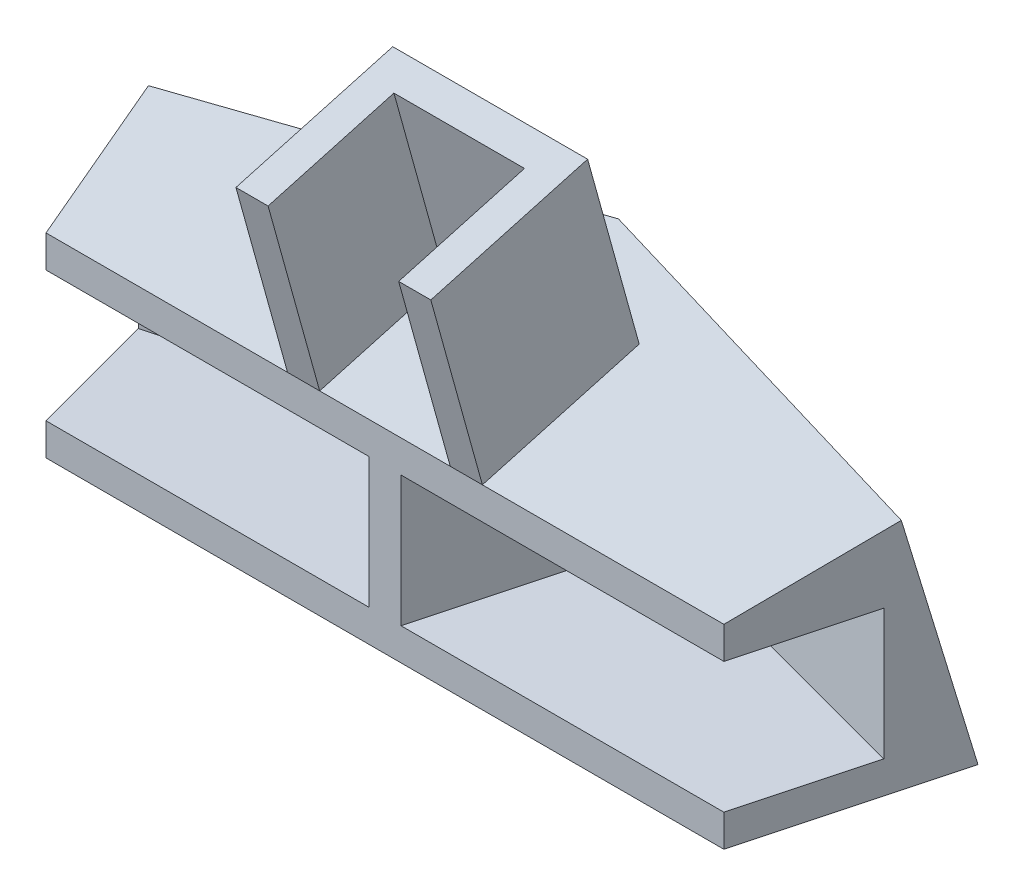
ISO-10303-21;
HEADER;
FILE_DESCRIPTION(('STEP AP214'),'2;1');
FILE_NAME('part.step','',(''),(''),'','','');
FILE_SCHEMA(('AUTOMOTIVE_DESIGN { 1 0 10303 214 1 1 1 1 }'));
ENDSEC;
DATA;
#1=APPLICATION_CONTEXT('core data for automotive mechanical design processes');
#2=APPLICATION_PROTOCOL_DEFINITION('international standard','automotive_design',2000,#1);
#3=PRODUCT_CONTEXT('',#1,'mechanical');
#4=PRODUCT('Part','Part','',(#3));
#5=PRODUCT_RELATED_PRODUCT_CATEGORY('part','',(#4));
#6=PRODUCT_DEFINITION_FORMATION('','',#4);
#7=PRODUCT_DEFINITION_CONTEXT('part definition',#1,'design');
#8=PRODUCT_DEFINITION('design','',#6,#7);
#9=PRODUCT_DEFINITION_SHAPE('','',#8);
#10=(LENGTH_UNIT() NAMED_UNIT(*) SI_UNIT(.MILLI.,.METRE.));
#11=(NAMED_UNIT(*) PLANE_ANGLE_UNIT() SI_UNIT($,.RADIAN.));
#12=(NAMED_UNIT(*) SI_UNIT($,.STERADIAN.) SOLID_ANGLE_UNIT());
#13=UNCERTAINTY_MEASURE_WITH_UNIT(LENGTH_MEASURE(1.E-05),#10,'distance_accuracy_value','');
#14=(GEOMETRIC_REPRESENTATION_CONTEXT(3) GLOBAL_UNCERTAINTY_ASSIGNED_CONTEXT((#13)) GLOBAL_UNIT_ASSIGNED_CONTEXT((#10,
#11,#12)) REPRESENTATION_CONTEXT('',''));
#15=CARTESIAN_POINT('',(0.,0.,0.));
#16=DIRECTION('',(0.,0.,1.));
#17=DIRECTION('',(1.,0.,0.));
#18=AXIS2_PLACEMENT_3D('',#15,#16,#17);
#19=CARTESIAN_POINT('',(-61.0498594987614,30.3,14.1213305174945));
#20=DIRECTION('',(0.,-0.963611374994283,-0.267307160363557));
#21=DIRECTION('',(0.,0.267307160363557,-0.963611374994283));
#22=AXIS2_PLACEMENT_3D('',#19,#20,#21);
#23=PLANE('',#22);
#24=DIRECTION('',(-1.,0.,0.));
#25=VECTOR('',#24,1.);
#26=CARTESIAN_POINT('',(-15.15,37.062871157198,-10.2580372698608));
#27=LINE('',#26,#25);
#28=CARTESIAN_POINT('',(15.15,37.062871157198,-10.2580372698608));
#29=VERTEX_POINT('',#28);
#30=CARTESIAN_POINT('',(-15.15,37.062871157198,-10.2580372698608));
#31=VERTEX_POINT('',#30);
#32=EDGE_CURVE('E278',#29,#31,#27,.T.);
#33=ORIENTED_EDGE('',*,*,#32,.F.);
#34=DIRECTION('',(0.,-0.267307160363556,0.963611374994283));
#35=VECTOR('',#34,1.);
#36=CARTESIAN_POINT('',(15.15,30.3,14.1213305174945));
#37=LINE('',#36,#35);
#38=CARTESIAN_POINT('',(15.15,30.3,14.1213305174945));
#39=VERTEX_POINT('',#38);
#40=EDGE_CURVE('E201',#29,#39,#37,.T.);
#41=ORIENTED_EDGE('',*,*,#40,.T.);
#42=DIRECTION('',(1.,0.,0.));
#43=VECTOR('',#42,1.);
#44=CARTESIAN_POINT('',(-61.0498594987614,30.3,14.1213305174945));
#45=LINE('',#44,#43);
#46=CARTESIAN_POINT('',(52.701522961763,30.3,14.1213305174945));
#47=VERTEX_POINT('',#46);
#48=EDGE_CURVE('E297',#39,#47,#45,.T.);
#49=ORIENTED_EDGE('',*,*,#48,.T.);
#50=DIRECTION('',(-0.249999999999998,-0.258819045102513,0.933012701892222));
#51=VECTOR('',#50,1.);
#52=CARTESIAN_POINT('',(60.796195201352,38.680221357873,-16.0883975512691));
#53=LINE('',#52,#51);
#54=CARTESIAN_POINT('',(58.5300727238019,36.3341587349735,-7.6311133288782));
#55=VERTEX_POINT('',#54);
#56=EDGE_CURVE('E189',#55,#47,#53,.T.);
#57=ORIENTED_EDGE('',*,*,#56,.F.);
#58=DIRECTION('',(0.968245836551855,-0.0668267900908885,0.240902843748568));
#59=VECTOR('',#58,1.);
#60=CARTESIAN_POINT('',(-59.042365341713,44.4488217084377,-36.8835341575611));
#61=LINE('',#60,#59);
#62=CARTESIAN_POINT('',(0.,40.3738114102148,-22.1935936739401));
#63=VERTEX_POINT('',#62);
#64=EDGE_CURVE('E11',#63,#55,#61,.T.);
#65=ORIENTED_EDGE('',*,*,#64,.F.);
#66=DIRECTION('',(0.968245836551855,0.0668267900908885,-0.240902843748568));
#67=VECTOR('',#66,1.);
#68=CARTESIAN_POINT('',(2.08207098063319,40.5175126430263,-22.7116199862526));
#69=LINE('',#68,#67);
#70=CARTESIAN_POINT('',(-58.5300727238019,36.3341587349735,-7.6311133288782));
#71=VERTEX_POINT('',#70);
#72=EDGE_CURVE('E41',#71,#63,#69,.T.);
#73=ORIENTED_EDGE('',*,*,#72,.F.);
#74=DIRECTION('',(-0.249999999999998,0.258819045102513,-0.933012701892222));
#75=VECTOR('',#74,1.);
#76=CARTESIAN_POINT('',(-60.796195201352,38.680221357873,-16.0883975512691));
#77=LINE('',#76,#75);
#78=CARTESIAN_POINT('',(-52.701522961763,30.3,14.1213305174945));
#79=VERTEX_POINT('',#78);
#80=EDGE_CURVE('E301',#79,#71,#77,.T.);
#81=ORIENTED_EDGE('',*,*,#80,.F.);
#82=CARTESIAN_POINT('',(-15.15,30.3,14.1213305174945));
#83=VERTEX_POINT('',#82);
#84=EDGE_CURVE('E298',#79,#83,#45,.T.);
#85=ORIENTED_EDGE('',*,*,#84,.T.);
#86=DIRECTION('',(0.,-0.267307160363556,0.963611374994283));
#87=VECTOR('',#86,1.);
#88=CARTESIAN_POINT('',(-15.15,30.3,14.1213305174945));
#89=LINE('',#88,#87);
#90=EDGE_CURVE('E281',#31,#83,#89,.T.);
#91=ORIENTED_EDGE('',*,*,#90,.F.);
#92=EDGE_LOOP('',(#33,#41,#49,#57,#65,#73,#81,#85,#91));
#93=FACE_BOUND('',#92,.T.);
#94=ADVANCED_FACE('F33',(#93),#23,.F.);
#95=CARTESIAN_POINT('',(63.1319304793945,5.,-24.805480281955));
#96=DIRECTION('',(0.965925826289069,0.,0.258819045102518));
#97=DIRECTION('',(0.258819045102518,0.,-0.965925826289069));
#98=AXIS2_PLACEMENT_3D('',#95,#96,#97);
#99=PLANE('',#98);
#100=DIRECTION('',(-0.0669872981077778,0.965925826289071,0.249999999999992));
#101=VECTOR('',#100,1.);
#102=CARTESIAN_POINT('',(61.0498594987614,0.,-17.0350855972672));
#103=LINE('',#102,#101);
#104=CARTESIAN_POINT('',(61.0498594987614,0.,-17.0350855972672));
#105=VERTEX_POINT('',#104);
#106=EDGE_CURVE('E223',#105,#55,#103,.T.);
#107=ORIENTED_EDGE('',*,*,#106,.T.);
#108=ORIENTED_EDGE('',*,*,#56,.T.);
#109=DIRECTION('',(0.,-1.,0.));
#110=VECTOR('',#109,1.);
#111=CARTESIAN_POINT('',(52.701522961763,45.3,14.1213305174945));
#112=LINE('',#111,#110);
#113=CARTESIAN_POINT('',(52.701522961763,25.3,14.1213305174945));
#114=VERTEX_POINT('',#113);
#115=EDGE_CURVE('E234',#47,#114,#112,.T.);
#116=ORIENTED_EDGE('',*,*,#115,.T.);
#117=DIRECTION('',(-0.258819045102518,0.,0.965925826289069));
#118=VECTOR('',#117,1.);
#119=CARTESIAN_POINT('',(52.701522961763,25.3,14.1213305174945));
#120=LINE('',#119,#118);
#121=CARTESIAN_POINT('',(57.9555495773441,25.3,-5.4869637561736));
#122=VERTEX_POINT('',#121);
#123=EDGE_CURVE('E231',#122,#114,#120,.T.);
#124=ORIENTED_EDGE('',*,*,#123,.F.);
#125=DIRECTION('',(0.,-1.,0.));
#126=VECTOR('',#125,1.);
#127=CARTESIAN_POINT('',(57.9555495773441,25.3,-5.4869637561736));
#128=LINE('',#127,#126);
#129=CARTESIAN_POINT('',(57.9555495773441,5.,-5.48696375617361));
#130=VERTEX_POINT('',#129);
#131=EDGE_CURVE('E239',#122,#130,#128,.T.);
#132=ORIENTED_EDGE('',*,*,#131,.T.);
#133=DIRECTION('',(-0.258819045102518,0.,0.965925826289069));
#134=VECTOR('',#133,1.);
#135=CARTESIAN_POINT('',(63.1319304793945,5.,-24.805480281955));
#136=LINE('',#135,#134);
#137=CARTESIAN_POINT('',(52.701522961763,5.,14.1213305174945));
#138=VERTEX_POINT('',#137);
#139=EDGE_CURVE('E246',#130,#138,#136,.T.);
#140=ORIENTED_EDGE('',*,*,#139,.T.);
#141=DIRECTION('',(0.,-1.,0.));
#142=VECTOR('',#141,1.);
#143=CARTESIAN_POINT('',(52.701522961763,5.,14.1213305174945));
#144=LINE('',#143,#142);
#145=CARTESIAN_POINT('',(52.701522961763,0.,14.1213305174945));
#146=VERTEX_POINT('',#145);
#147=EDGE_CURVE('E248',#138,#146,#144,.T.);
#148=ORIENTED_EDGE('',*,*,#147,.T.);
#149=DIRECTION('',(-0.258819045102518,0.,0.965925826289069));
#150=VECTOR('',#149,1.);
#151=CARTESIAN_POINT('',(63.1319304793945,0.,-24.805480281955));
#152=LINE('',#151,#150);
#153=EDGE_CURVE('E243',#105,#146,#152,.T.);
#154=ORIENTED_EDGE('',*,*,#153,.F.);
#155=EDGE_LOOP('',(#107,#108,#116,#124,#132,#140,#148,#154));
#156=FACE_BOUND('',#155,.T.);
#157=ADVANCED_FACE('F393',(#156),#99,.T.);
#158=CARTESIAN_POINT('',(0.,5.,14.1213305174945));
#159=DIRECTION('',(0.,0.,-1.));
#160=DIRECTION('',(-1.,0.,0.));
#161=AXIS2_PLACEMENT_3D('',#158,#159,#160);
#162=PLANE('',#161);
#163=ORIENTED_EDGE('',*,*,#115,.F.);
#164=ORIENTED_EDGE('',*,*,#48,.F.);
#165=DIRECTION('',(-1.,0.,0.));
#166=VECTOR('',#165,1.);
#167=CARTESIAN_POINT('',(10.15,30.3,14.1213305174945));
#168=LINE('',#167,#166);
#169=CARTESIAN_POINT('',(10.15,30.3,14.1213305174945));
#170=VERTEX_POINT('',#169);
#171=EDGE_CURVE('E211',#39,#170,#168,.T.);
#172=ORIENTED_EDGE('',*,*,#171,.T.);
#173=CARTESIAN_POINT('',(-10.15,30.3,14.1213305174945));
#174=VERTEX_POINT('',#173);
#175=EDGE_CURVE('E302',#174,#170,#45,.T.);
#176=ORIENTED_EDGE('',*,*,#175,.F.);
#177=DIRECTION('',(1.,0.,0.));
#178=VECTOR('',#177,1.);
#179=CARTESIAN_POINT('',(-10.15,30.3,14.1213305174945));
#180=LINE('',#179,#178);
#181=EDGE_CURVE('E265',#83,#174,#180,.T.);
#182=ORIENTED_EDGE('',*,*,#181,.F.);
#183=ORIENTED_EDGE('',*,*,#84,.F.);
#184=DIRECTION('',(0.,-1.,0.));
#185=VECTOR('',#184,1.);
#186=CARTESIAN_POINT('',(-52.701522961763,45.3,14.1213305174945));
#187=LINE('',#186,#185);
#188=CARTESIAN_POINT('',(-52.701522961763,25.3,14.1213305174945));
#189=VERTEX_POINT('',#188);
#190=EDGE_CURVE('E319',#79,#189,#187,.T.);
#191=ORIENTED_EDGE('',*,*,#190,.T.);
#192=DIRECTION('',(1.,0.,0.));
#193=VECTOR('',#192,1.);
#194=CARTESIAN_POINT('',(0.,25.3,14.1213305174945));
#195=LINE('',#194,#193);
#196=CARTESIAN_POINT('',(-2.5,25.3,14.1213305174945));
#197=VERTEX_POINT('',#196);
#198=EDGE_CURVE('E316',#189,#197,#195,.T.);
#199=ORIENTED_EDGE('',*,*,#198,.T.);
#200=DIRECTION('',(0.,-1.,0.));
#201=VECTOR('',#200,1.);
#202=CARTESIAN_POINT('',(-2.5,62.1541007624613,14.1213305174945));
#203=LINE('',#202,#201);
#204=CARTESIAN_POINT('',(-2.5,5.,14.1213305174945));
#205=VERTEX_POINT('',#204);
#206=EDGE_CURVE('E256',#197,#205,#203,.T.);
#207=ORIENTED_EDGE('',*,*,#206,.T.);
#208=DIRECTION('',(1.,0.,0.));
#209=VECTOR('',#208,1.);
#210=CARTESIAN_POINT('',(0.,5.,14.1213305174945));
#211=LINE('',#210,#209);
#212=CARTESIAN_POINT('',(-52.701522961763,5.,14.1213305174945));
#213=VERTEX_POINT('',#212);
#214=EDGE_CURVE('E333',#213,#205,#211,.T.);
#215=ORIENTED_EDGE('',*,*,#214,.F.);
#216=DIRECTION('',(0.,-1.,0.));
#217=VECTOR('',#216,1.);
#218=CARTESIAN_POINT('',(-52.701522961763,5.,14.1213305174945));
#219=LINE('',#218,#217);
#220=CARTESIAN_POINT('',(-52.701522961763,0.,14.1213305174945));
#221=VERTEX_POINT('',#220);
#222=EDGE_CURVE('E337',#213,#221,#219,.T.);
#223=ORIENTED_EDGE('',*,*,#222,.T.);
#224=DIRECTION('',(1.,0.,0.));
#225=VECTOR('',#224,1.);
#226=CARTESIAN_POINT('',(0.,0.,14.1213305174945));
#227=LINE('',#226,#225);
#228=EDGE_CURVE('E334',#221,#146,#227,.T.);
#229=ORIENTED_EDGE('',*,*,#228,.T.);
#230=ORIENTED_EDGE('',*,*,#147,.F.);
#231=DIRECTION('',(-1.,0.,0.));
#232=VECTOR('',#231,1.);
#233=CARTESIAN_POINT('',(0.,5.,14.1213305174945));
#234=LINE('',#233,#232);
#235=CARTESIAN_POINT('',(2.5,5.,14.1213305174945));
#236=VERTEX_POINT('',#235);
#237=EDGE_CURVE('E244',#138,#236,#234,.T.);
#238=ORIENTED_EDGE('',*,*,#237,.T.);
#239=DIRECTION('',(0.,-1.,0.));
#240=VECTOR('',#239,1.);
#241=CARTESIAN_POINT('',(2.5,62.1541007624613,14.1213305174945));
#242=LINE('',#241,#240);
#243=CARTESIAN_POINT('',(2.5,25.3,14.1213305174945));
#244=VERTEX_POINT('',#243);
#245=EDGE_CURVE('E212',#244,#236,#242,.T.);
#246=ORIENTED_EDGE('',*,*,#245,.F.);
#247=DIRECTION('',(-1.,0.,0.));
#248=VECTOR('',#247,1.);
#249=CARTESIAN_POINT('',(0.,25.3,14.1213305174945));
#250=LINE('',#249,#248);
#251=EDGE_CURVE('E229',#114,#244,#250,.T.);
#252=ORIENTED_EDGE('',*,*,#251,.F.);
#253=EDGE_LOOP('',(#163,#164,#172,#176,#182,#183,#191,#199,#207,#215,#223,#229,#230,#238,#246,#252));
#254=FACE_BOUND('',#253,.T.);
#255=ADVANCED_FACE('F357',(#254),#162,.F.);
#256=CARTESIAN_POINT('',(-59.042365341713,0.,-49.2137002605287));
#257=DIRECTION('',(0.249999999999998,0.258819045102513,-0.933012701892222));
#258=DIRECTION('',(0.,0.963611374994283,0.267307160363556));
#259=AXIS2_PLACEMENT_3D('',#256,#257,#258);
#260=PLANE('',#259);
#261=DIRECTION('',(0.,0.963611374994283,0.267307160363556));
#262=VECTOR('',#261,1.);
#263=CARTESIAN_POINT('',(0.,2.49753320224061,-32.7005268999761));
#264=LINE('',#263,#262);
#265=CARTESIAN_POINT('',(0.,0.,-33.3933461479936));
#266=VERTEX_POINT('',#265);
#267=EDGE_CURVE('E310',#266,#63,#264,.T.);
#268=ORIENTED_EDGE('',*,*,#267,.T.);
#269=ORIENTED_EDGE('',*,*,#64,.T.);
#270=ORIENTED_EDGE('',*,*,#106,.F.);
#271=DIRECTION('',(0.965925826289069,0.,0.258819045102518));
#272=VECTOR('',#271,1.);
#273=CARTESIAN_POINT('',(-59.042365341713,0.,-49.2137002605287));
#274=LINE('',#273,#272);
#275=EDGE_CURVE('E226',#266,#105,#274,.T.);
#276=ORIENTED_EDGE('',*,*,#275,.F.);
#277=EDGE_LOOP('',(#268,#269,#270,#276));
#278=FACE_BOUND('',#277,.T.);
#279=ADVANCED_FACE('F422',(#278),#260,.T.);
#280=CARTESIAN_POINT('',(0.,0.,0.));
#281=DIRECTION('',(0.,1.,0.));
#282=DIRECTION('',(0.,0.,1.));
#283=AXIS2_PLACEMENT_3D('',#280,#281,#282);
#284=PLANE('',#283);
#285=ORIENTED_EDGE('',*,*,#275,.T.);
#286=ORIENTED_EDGE('',*,*,#153,.T.);
#287=ORIENTED_EDGE('',*,*,#228,.F.);
#288=DIRECTION('',(0.258819045102518,0.,0.965925826289069));
#289=VECTOR('',#288,1.);
#290=CARTESIAN_POINT('',(-63.1319304793945,0.,-24.805480281955));
#291=LINE('',#290,#289);
#292=CARTESIAN_POINT('',(-61.0498594987614,0.,-17.0350855972672));
#293=VERTEX_POINT('',#292);
#294=EDGE_CURVE('E330',#293,#221,#291,.T.);
#295=ORIENTED_EDGE('',*,*,#294,.F.);
#296=DIRECTION('',(-0.965925826289069,0.,0.258819045102518));
#297=VECTOR('',#296,1.);
#298=CARTESIAN_POINT('',(2.08207098063319,0.,-33.9512353858385));
#299=LINE('',#298,#297);
#300=EDGE_CURVE('E308',#266,#293,#299,.T.);
#301=ORIENTED_EDGE('',*,*,#300,.F.);
#302=EDGE_LOOP('',(#285,#286,#287,#295,#301));
#303=FACE_BOUND('',#302,.T.);
#304=ADVANCED_FACE('F419',(#303),#284,.F.);
#305=CARTESIAN_POINT('',(0.,5.,0.));
#306=DIRECTION('',(0.,1.,0.));
#307=DIRECTION('',(0.,0.,1.));
#308=AXIS2_PLACEMENT_3D('',#305,#306,#307);
#309=PLANE('',#308);
#310=ORIENTED_EDGE('',*,*,#214,.T.);
#311=DIRECTION('',(0.258819045102518,0.,0.965925826289069));
#312=VECTOR('',#311,1.);
#313=CARTESIAN_POINT('',(-2.5,5.,14.1213305174945));
#314=LINE('',#313,#312);
#315=CARTESIAN_POINT('',(-11.1168909996853,5.,-18.0373444966142));
#316=VERTEX_POINT('',#315);
#317=EDGE_CURVE('E253',#316,#205,#314,.T.);
#318=ORIENTED_EDGE('',*,*,#317,.F.);
#319=DIRECTION('',(0.965925826289069,0.,-0.258819045102518));
#320=VECTOR('',#319,1.);
#321=CARTESIAN_POINT('',(-57.9555495773441,5.,-5.4869637561736));
#322=LINE('',#321,#320);
#323=CARTESIAN_POINT('',(-57.9555495773441,5.,-5.4869637561736));
#324=VERTEX_POINT('',#323);
#325=EDGE_CURVE('E321',#324,#316,#322,.T.);
#326=ORIENTED_EDGE('',*,*,#325,.F.);
#327=DIRECTION('',(0.258819045102518,0.,0.965925826289069));
#328=VECTOR('',#327,1.);
#329=CARTESIAN_POINT('',(-63.1319304793945,5.,-24.805480281955));
#330=LINE('',#329,#328);
#331=EDGE_CURVE('E331',#324,#213,#330,.T.);
#332=ORIENTED_EDGE('',*,*,#331,.T.);
#333=EDGE_LOOP('',(#310,#318,#326,#332));
#334=FACE_BOUND('',#333,.T.);
#335=ADVANCED_FACE('F413',(#334),#309,.T.);
#336=CARTESIAN_POINT('',(-57.9555495773441,25.3,-5.4869637561736));
#337=DIRECTION('',(-0.258819045102518,0.,-0.965925826289069));
#338=DIRECTION('',(-0.965925826289069,0.,0.258819045102518));
#339=AXIS2_PLACEMENT_3D('',#336,#337,#338);
#340=PLANE('',#339);
#341=DIRECTION('',(0.,-1.,0.));
#342=VECTOR('',#341,1.);
#343=CARTESIAN_POINT('',(-11.1168909996853,62.1541007624613,-18.0373444966142));
#344=LINE('',#343,#342);
#345=CARTESIAN_POINT('',(-11.1168909996853,25.3,-18.0373444966142));
#346=VERTEX_POINT('',#345);
#347=EDGE_CURVE('E252',#346,#316,#344,.T.);
#348=ORIENTED_EDGE('',*,*,#347,.F.);
#349=DIRECTION('',(0.965925826289069,0.,-0.258819045102518));
#350=VECTOR('',#349,1.);
#351=CARTESIAN_POINT('',(-57.9555495773441,25.3,-5.4869637561736));
#352=LINE('',#351,#350);
#353=CARTESIAN_POINT('',(-57.9555495773441,25.3,-5.4869637561736));
#354=VERTEX_POINT('',#353);
#355=EDGE_CURVE('E322',#354,#346,#352,.T.);
#356=ORIENTED_EDGE('',*,*,#355,.F.);
#357=DIRECTION('',(0.,-1.,0.));
#358=VECTOR('',#357,1.);
#359=CARTESIAN_POINT('',(-57.9555495773441,25.3,-5.4869637561736));
#360=LINE('',#359,#358);
#361=EDGE_CURVE('E325',#354,#324,#360,.T.);
#362=ORIENTED_EDGE('',*,*,#361,.T.);
#363=ORIENTED_EDGE('',*,*,#325,.T.);
#364=EDGE_LOOP('',(#348,#356,#362,#363));
#365=FACE_BOUND('',#364,.T.);
#366=ADVANCED_FACE('F407',(#365),#340,.F.);
#367=CARTESIAN_POINT('',(0.,25.3,0.));
#368=DIRECTION('',(0.,1.,0.));
#369=DIRECTION('',(0.,0.,1.));
#370=AXIS2_PLACEMENT_3D('',#367,#368,#369);
#371=PLANE('',#370);
#372=DIRECTION('',(0.258819045102518,0.,0.965925826289069));
#373=VECTOR('',#372,1.);
#374=CARTESIAN_POINT('',(-2.5,25.3,14.1213305174945));
#375=LINE('',#374,#373);
#376=EDGE_CURVE('E257',#346,#197,#375,.T.);
#377=ORIENTED_EDGE('',*,*,#376,.T.);
#378=ORIENTED_EDGE('',*,*,#198,.F.);
#379=DIRECTION('',(0.258819045102518,0.,0.965925826289069));
#380=VECTOR('',#379,1.);
#381=CARTESIAN_POINT('',(-52.701522961763,25.3,14.1213305174945));
#382=LINE('',#381,#380);
#383=EDGE_CURVE('E313',#354,#189,#382,.T.);
#384=ORIENTED_EDGE('',*,*,#383,.F.);
#385=ORIENTED_EDGE('',*,*,#355,.T.);
#386=EDGE_LOOP('',(#377,#378,#384,#385));
#387=FACE_BOUND('',#386,.T.);
#388=ADVANCED_FACE('F402',(#387),#371,.F.);
#389=ORIENTED_EDGE('',*,*,#175,.T.);
#390=DIRECTION('',(0.,0.267307160363557,-0.963611374994283));
#391=VECTOR('',#390,1.);
#392=CARTESIAN_POINT('',(10.15,30.3,14.1213305174945));
#393=LINE('',#392,#391);
#394=CARTESIAN_POINT('',(10.15,35.7263353553802,-5.43998039488942));
#395=VERTEX_POINT('',#394);
#396=EDGE_CURVE('E184',#170,#395,#393,.T.);
#397=ORIENTED_EDGE('',*,*,#396,.T.);
#398=DIRECTION('',(1.,0.,0.));
#399=VECTOR('',#398,1.);
#400=CARTESIAN_POINT('',(-10.15,35.7263353553802,-5.43998039488942));
#401=LINE('',#400,#399);
#402=CARTESIAN_POINT('',(-10.15,35.7263353553802,-5.43998039488942));
#403=VERTEX_POINT('',#402);
#404=EDGE_CURVE('E276',#403,#395,#401,.T.);
#405=ORIENTED_EDGE('',*,*,#404,.F.);
#406=DIRECTION('',(0.,0.267307160363557,-0.963611374994283));
#407=VECTOR('',#406,1.);
#408=CARTESIAN_POINT('',(-10.15,30.3,14.1213305174945));
#409=LINE('',#408,#407);
#410=EDGE_CURVE('E260',#174,#403,#409,.T.);
#411=ORIENTED_EDGE('',*,*,#410,.F.);
#412=EDGE_LOOP('',(#389,#397,#405,#411));
#413=FACE_BOUND('',#412,.T.);
#414=ADVANCED_FACE('F379',(#413),#23,.F.);
#415=CARTESIAN_POINT('',(-63.1319304793945,5.,-24.805480281955));
#416=DIRECTION('',(0.965925826289069,0.,-0.258819045102518));
#417=DIRECTION('',(-0.258819045102518,0.,-0.965925826289069));
#418=AXIS2_PLACEMENT_3D('',#415,#416,#417);
#419=PLANE('',#418);
#420=ORIENTED_EDGE('',*,*,#190,.F.);
#421=ORIENTED_EDGE('',*,*,#80,.T.);
#422=DIRECTION('',(0.0669872981077778,0.965925826289071,0.249999999999992));
#423=VECTOR('',#422,1.);
#424=CARTESIAN_POINT('',(-61.0498594987614,0.,-17.0350855972672));
#425=LINE('',#424,#423);
#426=EDGE_CURVE('E305',#293,#71,#425,.T.);
#427=ORIENTED_EDGE('',*,*,#426,.F.);
#428=ORIENTED_EDGE('',*,*,#294,.T.);
#429=ORIENTED_EDGE('',*,*,#222,.F.);
#430=ORIENTED_EDGE('',*,*,#331,.F.);
#431=ORIENTED_EDGE('',*,*,#361,.F.);
#432=ORIENTED_EDGE('',*,*,#383,.T.);
#433=EDGE_LOOP('',(#420,#421,#427,#428,#429,#430,#431,#432));
#434=FACE_BOUND('',#433,.T.);
#435=ADVANCED_FACE('F35',(#434),#419,.F.);
#436=CARTESIAN_POINT('',(2.08207098063319,0.,-33.9512353858385));
#437=DIRECTION('',(0.249999999999998,-0.258819045102513,0.933012701892222));
#438=DIRECTION('',(0.,-0.963611374994283,-0.267307160363556));
#439=AXIS2_PLACEMENT_3D('',#436,#437,#438);
#440=PLANE('',#439);
#441=ORIENTED_EDGE('',*,*,#426,.T.);
#442=ORIENTED_EDGE('',*,*,#72,.T.);
#443=ORIENTED_EDGE('',*,*,#267,.F.);
#444=ORIENTED_EDGE('',*,*,#300,.T.);
#445=EDGE_LOOP('',(#441,#442,#443,#444));
#446=FACE_BOUND('',#445,.T.);
#447=ADVANCED_FACE('F345',(#446),#440,.F.);
#448=CARTESIAN_POINT('',(-10.15,59.2083412498285,22.1405453284012));
#449=DIRECTION('',(-1.,0.,0.));
#450=DIRECTION('',(0.,-1.,0.));
#451=AXIS2_PLACEMENT_3D('',#448,#449,#450);
#452=PLANE('',#451);
#453=ORIENTED_EDGE('',*,*,#410,.T.);
#454=DIRECTION('',(0.,-0.963611374994283,-0.267307160363557));
#455=VECTOR('',#454,1.);
#456=CARTESIAN_POINT('',(-10.15,64.6346766052087,2.57923441601728));
#457=LINE('',#456,#455);
#458=CARTESIAN_POINT('',(-10.15,64.6346766052087,2.57923441601728));
#459=VERTEX_POINT('',#458);
#460=EDGE_CURVE('E294',#459,#403,#457,.T.);
#461=ORIENTED_EDGE('',*,*,#460,.F.);
#462=DIRECTION('',(0.,0.267307160363557,-0.963611374994283));
#463=VECTOR('',#462,1.);
#464=CARTESIAN_POINT('',(-10.15,59.2083412498285,22.1405453284012));
#465=LINE('',#464,#463);
#466=CARTESIAN_POINT('',(-10.15,59.2083412498285,22.1405453284012));
#467=VERTEX_POINT('',#466);
#468=EDGE_CURVE('E263',#467,#459,#465,.T.);
#469=ORIENTED_EDGE('',*,*,#468,.F.);
#470=DIRECTION('',(0.,-0.963611374994283,-0.267307160363557));
#471=VECTOR('',#470,1.);
#472=CARTESIAN_POINT('',(-10.15,59.2083412498285,22.1405453284012));
#473=LINE('',#472,#471);
#474=EDGE_CURVE('E273',#467,#174,#473,.T.);
#475=ORIENTED_EDGE('',*,*,#474,.T.);
#476=EDGE_LOOP('',(#453,#461,#469,#475));
#477=FACE_BOUND('',#476,.T.);
#478=ADVANCED_FACE('F381',(#477),#452,.F.);
#479=CARTESIAN_POINT('',(-10.15,64.6346766052087,2.57923441601728));
#480=DIRECTION('',(0.,0.267307160363557,-0.963611374994283));
#481=DIRECTION('',(0.,0.963611374994283,0.267307160363557));
#482=AXIS2_PLACEMENT_3D('',#479,#480,#481);
#483=PLANE('',#482);
#484=ORIENTED_EDGE('',*,*,#404,.T.);
#485=DIRECTION('',(0.,-0.963611374994283,-0.267307160363557));
#486=VECTOR('',#485,1.);
#487=CARTESIAN_POINT('',(10.15,64.6346766052087,2.57923441601727));
#488=LINE('',#487,#486);
#489=CARTESIAN_POINT('',(10.15,64.6346766052087,2.57923441601727));
#490=VERTEX_POINT('',#489);
#491=EDGE_CURVE('E206',#490,#395,#488,.T.);
#492=ORIENTED_EDGE('',*,*,#491,.F.);
#493=DIRECTION('',(1.,0.,0.));
#494=VECTOR('',#493,1.);
#495=CARTESIAN_POINT('',(-10.15,64.6346766052087,2.57923441601728));
#496=LINE('',#495,#494);
#497=EDGE_CURVE('E199',#459,#490,#496,.T.);
#498=ORIENTED_EDGE('',*,*,#497,.F.);
#499=ORIENTED_EDGE('',*,*,#460,.T.);
#500=EDGE_LOOP('',(#484,#492,#498,#499));
#501=FACE_BOUND('',#500,.T.);
#502=ADVANCED_FACE('F383',(#501),#483,.F.);
#503=CARTESIAN_POINT('',(-15.15,65.9712124070265,-2.23882245895414));
#504=DIRECTION('',(0.,-0.267307160363557,0.963611374994283));
#505=DIRECTION('',(0.,-0.963611374994283,-0.267307160363557));
#506=AXIS2_PLACEMENT_3D('',#503,#504,#505);
#507=PLANE('',#506);
#508=ORIENTED_EDGE('',*,*,#32,.T.);
#509=DIRECTION('',(0.,-0.963611374994283,-0.267307160363557));
#510=VECTOR('',#509,1.);
#511=CARTESIAN_POINT('',(-15.15,65.9712124070265,-2.23882245895414));
#512=LINE('',#511,#510);
#513=CARTESIAN_POINT('',(-15.15,65.9712124070265,-2.23882245895414));
#514=VERTEX_POINT('',#513);
#515=EDGE_CURVE('E291',#514,#31,#512,.T.);
#516=ORIENTED_EDGE('',*,*,#515,.F.);
#517=DIRECTION('',(-1.,0.,0.));
#518=VECTOR('',#517,1.);
#519=CARTESIAN_POINT('',(-15.15,65.9712124070265,-2.23882245895414));
#520=LINE('',#519,#518);
#521=CARTESIAN_POINT('',(15.15,65.9712124070265,-2.23882245895414));
#522=VERTEX_POINT('',#521);
#523=EDGE_CURVE('E267',#522,#514,#520,.T.);
#524=ORIENTED_EDGE('',*,*,#523,.F.);
#525=DIRECTION('',(0.,-0.963611374994283,-0.267307160363557));
#526=VECTOR('',#525,1.);
#527=CARTESIAN_POINT('',(15.15,65.9712124070265,-2.23882245895414));
#528=LINE('',#527,#526);
#529=EDGE_CURVE('E217',#522,#29,#528,.T.);
#530=ORIENTED_EDGE('',*,*,#529,.T.);
#531=EDGE_LOOP('',(#508,#516,#524,#530));
#532=FACE_BOUND('',#531,.T.);
#533=ADVANCED_FACE('F372',(#532),#507,.F.);
#534=CARTESIAN_POINT('',(-15.15,59.2083412498285,22.1405453284012));
#535=DIRECTION('',(1.,0.,0.));
#536=DIRECTION('',(0.,1.,0.));
#537=AXIS2_PLACEMENT_3D('',#534,#535,#536);
#538=PLANE('',#537);
#539=ORIENTED_EDGE('',*,*,#90,.T.);
#540=DIRECTION('',(0.,-0.963611374994283,-0.267307160363557));
#541=VECTOR('',#540,1.);
#542=CARTESIAN_POINT('',(-15.15,59.2083412498285,22.1405453284012));
#543=LINE('',#542,#541);
#544=CARTESIAN_POINT('',(-15.15,59.2083412498285,22.1405453284012));
#545=VERTEX_POINT('',#544);
#546=EDGE_CURVE('E288',#545,#83,#543,.T.);
#547=ORIENTED_EDGE('',*,*,#546,.F.);
#548=DIRECTION('',(0.,-0.267307160363556,0.963611374994283));
#549=VECTOR('',#548,1.);
#550=CARTESIAN_POINT('',(-15.15,59.2083412498285,22.1405453284012));
#551=LINE('',#550,#549);
#552=EDGE_CURVE('E269',#514,#545,#551,.T.);
#553=ORIENTED_EDGE('',*,*,#552,.F.);
#554=ORIENTED_EDGE('',*,*,#515,.T.);
#555=EDGE_LOOP('',(#539,#547,#553,#554));
#556=FACE_BOUND('',#555,.T.);
#557=ADVANCED_FACE('F361',(#556),#538,.F.);
#558=CARTESIAN_POINT('',(-10.15,59.2083412498285,22.1405453284012));
#559=DIRECTION('',(0.,0.267307160363557,-0.963611374994283));
#560=DIRECTION('',(0.,0.963611374994283,0.267307160363557));
#561=AXIS2_PLACEMENT_3D('',#558,#559,#560);
#562=PLANE('',#561);
#563=ORIENTED_EDGE('',*,*,#181,.T.);
#564=ORIENTED_EDGE('',*,*,#474,.F.);
#565=DIRECTION('',(1.,0.,0.));
#566=VECTOR('',#565,1.);
#567=CARTESIAN_POINT('',(-10.15,59.2083412498285,22.1405453284012));
#568=LINE('',#567,#566);
#569=EDGE_CURVE('E271',#545,#467,#568,.T.);
#570=ORIENTED_EDGE('',*,*,#569,.F.);
#571=ORIENTED_EDGE('',*,*,#546,.T.);
#572=EDGE_LOOP('',(#563,#564,#570,#571));
#573=FACE_BOUND('',#572,.T.);
#574=ADVANCED_FACE('F366',(#573),#562,.F.);
#575=CARTESIAN_POINT('',(0.,60.6806872012282,16.8329085828462));
#576=DIRECTION('',(0.,-0.963611374994283,-0.267307160363557));
#577=DIRECTION('',(0.,0.267307160363557,-0.963611374994283));
#578=AXIS2_PLACEMENT_3D('',#575,#576,#577);
#579=PLANE('',#578);
#580=ORIENTED_EDGE('',*,*,#468,.T.);
#581=ORIENTED_EDGE('',*,*,#497,.T.);
#582=DIRECTION('',(0.,0.267307160363557,-0.963611374994283));
#583=VECTOR('',#582,1.);
#584=CARTESIAN_POINT('',(10.15,59.2083412498285,22.1405453284012));
#585=LINE('',#584,#583);
#586=CARTESIAN_POINT('',(10.15,59.2083412498285,22.1405453284012));
#587=VERTEX_POINT('',#586);
#588=EDGE_CURVE('E182',#587,#490,#585,.T.);
#589=ORIENTED_EDGE('',*,*,#588,.F.);
#590=DIRECTION('',(-1.,0.,0.));
#591=VECTOR('',#590,1.);
#592=CARTESIAN_POINT('',(10.15,59.2083412498285,22.1405453284012));
#593=LINE('',#592,#591);
#594=CARTESIAN_POINT('',(15.15,59.2083412498285,22.1405453284012));
#595=VERTEX_POINT('',#594);
#596=EDGE_CURVE('E197',#595,#587,#593,.T.);
#597=ORIENTED_EDGE('',*,*,#596,.F.);
#598=DIRECTION('',(0.,-0.267307160363556,0.963611374994283));
#599=VECTOR('',#598,1.);
#600=CARTESIAN_POINT('',(15.15,59.2083412498285,22.1405453284012));
#601=LINE('',#600,#599);
#602=EDGE_CURVE('E204',#522,#595,#601,.T.);
#603=ORIENTED_EDGE('',*,*,#602,.F.);
#604=ORIENTED_EDGE('',*,*,#523,.T.);
#605=ORIENTED_EDGE('',*,*,#552,.T.);
#606=ORIENTED_EDGE('',*,*,#569,.T.);
#607=EDGE_LOOP('',(#580,#581,#589,#597,#603,#604,#605,#606));
#608=FACE_BOUND('',#607,.T.);
#609=ADVANCED_FACE('F195',(#608),#579,.F.);
#610=CARTESIAN_POINT('',(-2.5,62.1541007624613,14.1213305174945));
#611=DIRECTION('',(0.965925826289069,0.,-0.258819045102518));
#612=DIRECTION('',(-0.258819045102518,0.,-0.965925826289069));
#613=AXIS2_PLACEMENT_3D('',#610,#611,#612);
#614=PLANE('',#613);
#615=ORIENTED_EDGE('',*,*,#376,.F.);
#616=ORIENTED_EDGE('',*,*,#347,.T.);
#617=ORIENTED_EDGE('',*,*,#317,.T.);
#618=ORIENTED_EDGE('',*,*,#206,.F.);
#619=EDGE_LOOP('',(#615,#616,#617,#618));
#620=FACE_BOUND('',#619,.T.);
#621=ADVANCED_FACE('F444',(#620),#614,.F.);
#622=CARTESIAN_POINT('',(0.,5.,0.));
#623=DIRECTION('',(0.,1.,0.));
#624=DIRECTION('',(0.,0.,1.));
#625=AXIS2_PLACEMENT_3D('',#622,#623,#624);
#626=PLANE('',#625);
#627=DIRECTION('',(-0.258819045102518,0.,0.965925826289069));
#628=VECTOR('',#627,1.);
#629=CARTESIAN_POINT('',(2.5,5.,14.1213305174945));
#630=LINE('',#629,#628);
#631=CARTESIAN_POINT('',(11.1168909996852,5.,-18.0373444966142));
#632=VERTEX_POINT('',#631);
#633=EDGE_CURVE('E48',#632,#236,#630,.T.);
#634=ORIENTED_EDGE('',*,*,#633,.T.);
#635=ORIENTED_EDGE('',*,*,#237,.F.);
#636=ORIENTED_EDGE('',*,*,#139,.F.);
#637=DIRECTION('',(-0.965925826289069,0.,-0.258819045102518));
#638=VECTOR('',#637,1.);
#639=CARTESIAN_POINT('',(57.9555495773441,5.,-5.4869637561736));
#640=LINE('',#639,#638);
#641=EDGE_CURVE('E236',#130,#632,#640,.T.);
#642=ORIENTED_EDGE('',*,*,#641,.T.);
#643=EDGE_LOOP('',(#634,#635,#636,#642));
#644=FACE_BOUND('',#643,.T.);
#645=ADVANCED_FACE('F442',(#644),#626,.T.);
#646=CARTESIAN_POINT('',(57.9555495773441,25.3,-5.4869637561736));
#647=DIRECTION('',(-0.258819045102518,0.,0.965925826289069));
#648=DIRECTION('',(0.965925826289069,0.,0.258819045102518));
#649=AXIS2_PLACEMENT_3D('',#646,#647,#648);
#650=PLANE('',#649);
#651=DIRECTION('',(0.,-1.,0.));
#652=VECTOR('',#651,1.);
#653=CARTESIAN_POINT('',(11.1168909996852,62.1541007624613,-18.0373444966142));
#654=LINE('',#653,#652);
#655=CARTESIAN_POINT('',(11.1168909996853,25.3,-18.0373444966142));
#656=VERTEX_POINT('',#655);
#657=EDGE_CURVE('E56',#656,#632,#654,.T.);
#658=ORIENTED_EDGE('',*,*,#657,.T.);
#659=ORIENTED_EDGE('',*,*,#641,.F.);
#660=ORIENTED_EDGE('',*,*,#131,.F.);
#661=DIRECTION('',(-0.965925826289069,0.,-0.258819045102518));
#662=VECTOR('',#661,1.);
#663=CARTESIAN_POINT('',(57.9555495773441,25.3,-5.4869637561736));
#664=LINE('',#663,#662);
#665=EDGE_CURVE('E237',#122,#656,#664,.T.);
#666=ORIENTED_EDGE('',*,*,#665,.T.);
#667=EDGE_LOOP('',(#658,#659,#660,#666));
#668=FACE_BOUND('',#667,.T.);
#669=ADVANCED_FACE('F438',(#668),#650,.T.);
#670=CARTESIAN_POINT('',(0.,25.3,0.));
#671=DIRECTION('',(0.,1.,0.));
#672=DIRECTION('',(0.,0.,1.));
#673=AXIS2_PLACEMENT_3D('',#670,#671,#672);
#674=PLANE('',#673);
#675=ORIENTED_EDGE('',*,*,#251,.T.);
#676=DIRECTION('',(-0.258819045102518,0.,0.965925826289069));
#677=VECTOR('',#676,1.);
#678=CARTESIAN_POINT('',(2.5,25.3,14.1213305174945));
#679=LINE('',#678,#677);
#680=EDGE_CURVE('E649',#656,#244,#679,.T.);
#681=ORIENTED_EDGE('',*,*,#680,.F.);
#682=ORIENTED_EDGE('',*,*,#665,.F.);
#683=ORIENTED_EDGE('',*,*,#123,.T.);
#684=EDGE_LOOP('',(#675,#681,#682,#683));
#685=FACE_BOUND('',#684,.T.);
#686=ADVANCED_FACE('F435',(#685),#674,.F.);
#687=CARTESIAN_POINT('',(10.15,59.2083412498285,22.1405453284012));
#688=DIRECTION('',(-1.,0.,0.));
#689=DIRECTION('',(0.,0.,1.));
#690=AXIS2_PLACEMENT_3D('',#687,#688,#689);
#691=PLANE('',#690);
#692=ORIENTED_EDGE('',*,*,#396,.F.);
#693=DIRECTION('',(0.,-0.963611374994283,-0.267307160363557));
#694=VECTOR('',#693,1.);
#695=CARTESIAN_POINT('',(10.15,59.2083412498285,22.1405453284012));
#696=LINE('',#695,#694);
#697=EDGE_CURVE('E178',#587,#170,#696,.T.);
#698=ORIENTED_EDGE('',*,*,#697,.F.);
#699=ORIENTED_EDGE('',*,*,#588,.T.);
#700=ORIENTED_EDGE('',*,*,#491,.T.);
#701=EDGE_LOOP('',(#692,#698,#699,#700));
#702=FACE_BOUND('',#701,.T.);
#703=ADVANCED_FACE('F180',(#702),#691,.T.);
#704=CARTESIAN_POINT('',(10.15,59.2083412498285,22.1405453284012));
#705=DIRECTION('',(0.,-0.267307160363557,0.963611374994283));
#706=DIRECTION('',(0.,-0.963611374994283,-0.267307160363557));
#707=AXIS2_PLACEMENT_3D('',#704,#705,#706);
#708=PLANE('',#707);
#709=ORIENTED_EDGE('',*,*,#171,.F.);
#710=DIRECTION('',(0.,-0.963611374994283,-0.267307160363557));
#711=VECTOR('',#710,1.);
#712=CARTESIAN_POINT('',(15.15,59.2083412498285,22.1405453284012));
#713=LINE('',#712,#711);
#714=EDGE_CURVE('E190',#595,#39,#713,.T.);
#715=ORIENTED_EDGE('',*,*,#714,.F.);
#716=ORIENTED_EDGE('',*,*,#596,.T.);
#717=ORIENTED_EDGE('',*,*,#697,.T.);
#718=EDGE_LOOP('',(#709,#715,#716,#717));
#719=FACE_BOUND('',#718,.T.);
#720=ADVANCED_FACE('F203',(#719),#708,.T.);
#721=CARTESIAN_POINT('',(15.15,59.2083412498285,22.1405453284012));
#722=DIRECTION('',(1.,0.,0.));
#723=DIRECTION('',(0.,0.,-1.));
#724=AXIS2_PLACEMENT_3D('',#721,#722,#723);
#725=PLANE('',#724);
#726=ORIENTED_EDGE('',*,*,#40,.F.);
#727=ORIENTED_EDGE('',*,*,#529,.F.);
#728=ORIENTED_EDGE('',*,*,#602,.T.);
#729=ORIENTED_EDGE('',*,*,#714,.T.);
#730=EDGE_LOOP('',(#726,#727,#728,#729));
#731=FACE_BOUND('',#730,.T.);
#732=ADVANCED_FACE('F495',(#731),#725,.T.);
#733=CARTESIAN_POINT('',(2.5,62.1541007624613,14.1213305174945));
#734=DIRECTION('',(0.965925826289069,0.,0.258819045102518));
#735=DIRECTION('',(0.258819045102518,0.,-0.965925826289069));
#736=AXIS2_PLACEMENT_3D('',#733,#734,#735);
#737=PLANE('',#736);
#738=ORIENTED_EDGE('',*,*,#657,.F.);
#739=ORIENTED_EDGE('',*,*,#680,.T.);
#740=ORIENTED_EDGE('',*,*,#245,.T.);
#741=ORIENTED_EDGE('',*,*,#633,.F.);
#742=EDGE_LOOP('',(#738,#739,#740,#741));
#743=FACE_BOUND('',#742,.T.);
#744=ADVANCED_FACE('F501',(#743),#737,.T.);
#745=CLOSED_SHELL('',(#94,#157,#255,#279,#304,#335,#366,#388,#414,#435,#447,#478,#502,#533,#557,
#574,#609,#621,#645,#669,#686,#703,#720,#732,#744));
#746=MANIFOLD_SOLID_BREP('B2',#745);
#747=ADVANCED_BREP_SHAPE_REPRESENTATION('',(#18,#746),#14);
#748=SHAPE_DEFINITION_REPRESENTATION(#9,#747);
ENDSEC;
END-ISO-10303-21;
